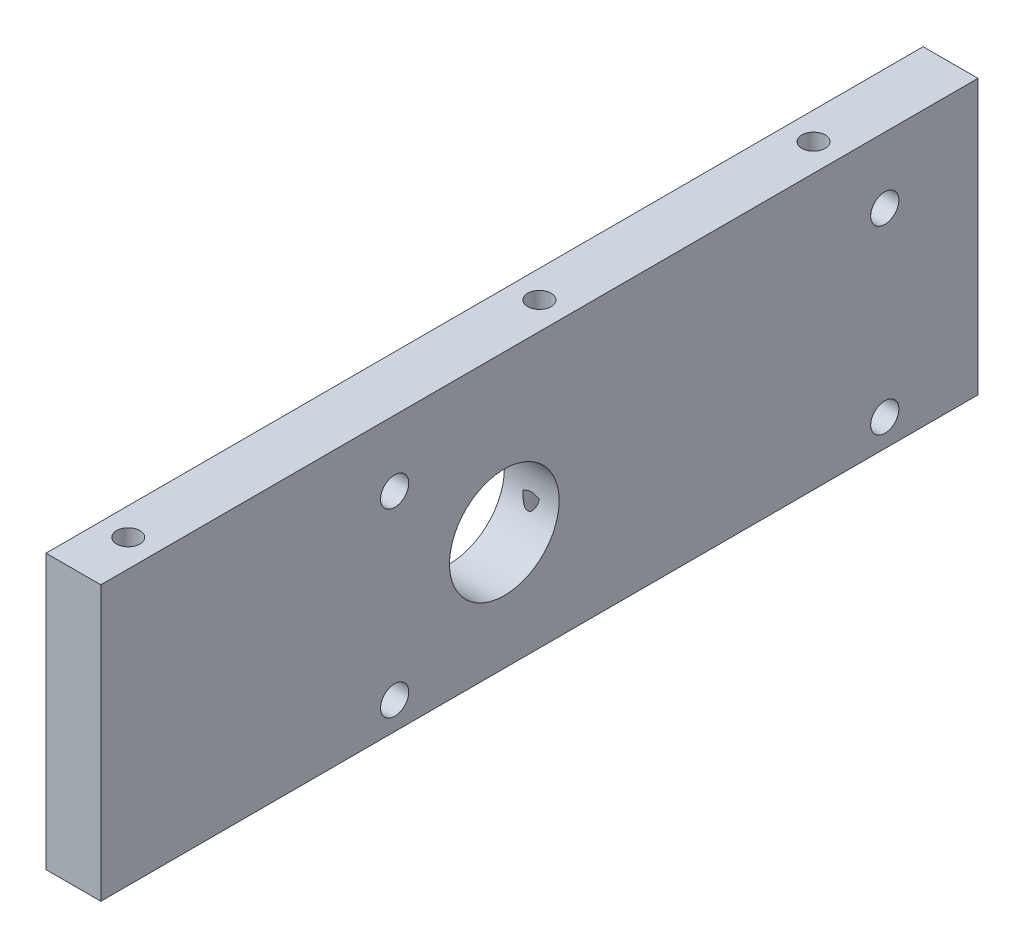
ISO-10303-21;
HEADER;
FILE_DESCRIPTION(('STEP AP214'),'2;1');
FILE_NAME('part.step','',(''),(''),'','','');
FILE_SCHEMA(('AUTOMOTIVE_DESIGN { 1 0 10303 214 1 1 1 1 }'));
ENDSEC;
DATA;
#1=APPLICATION_CONTEXT('core data for automotive mechanical design processes');
#2=APPLICATION_PROTOCOL_DEFINITION('international standard','automotive_design',2000,#1);
#3=PRODUCT_CONTEXT('',#1,'mechanical');
#4=PRODUCT('Part','Part','',(#3));
#5=PRODUCT_RELATED_PRODUCT_CATEGORY('part','',(#4));
#6=PRODUCT_DEFINITION_FORMATION('','',#4);
#7=PRODUCT_DEFINITION_CONTEXT('part definition',#1,'design');
#8=PRODUCT_DEFINITION('design','',#6,#7);
#9=PRODUCT_DEFINITION_SHAPE('','',#8);
#10=(LENGTH_UNIT() NAMED_UNIT(*) SI_UNIT(.MILLI.,.METRE.));
#11=(NAMED_UNIT(*) PLANE_ANGLE_UNIT() SI_UNIT($,.RADIAN.));
#12=(NAMED_UNIT(*) SI_UNIT($,.STERADIAN.) SOLID_ANGLE_UNIT());
#13=UNCERTAINTY_MEASURE_WITH_UNIT(LENGTH_MEASURE(1.E-05),#10,'distance_accuracy_value','');
#14=(GEOMETRIC_REPRESENTATION_CONTEXT(3) GLOBAL_UNCERTAINTY_ASSIGNED_CONTEXT((#13)) GLOBAL_UNIT_ASSIGNED_CONTEXT((#10,
#11,#12)) REPRESENTATION_CONTEXT('',''));
#15=CARTESIAN_POINT('',(0.,0.,0.));
#16=DIRECTION('',(0.,0.,1.));
#17=DIRECTION('',(1.,0.,0.));
#18=AXIS2_PLACEMENT_3D('',#15,#16,#17);
#19=CARTESIAN_POINT('',(3.175,-15.875,-50.8));
#20=DIRECTION('',(0.,0.,1.));
#21=DIRECTION('',(1.,0.,0.));
#22=AXIS2_PLACEMENT_3D('',#19,#20,#21);
#23=PLANE('',#22);
#24=DIRECTION('',(0.,1.,0.));
#25=VECTOR('',#24,1.);
#26=CARTESIAN_POINT('',(-3.175,-15.875,-50.8));
#27=LINE('',#26,#25);
#28=CARTESIAN_POINT('',(-3.175,-15.875,-50.8));
#29=VERTEX_POINT('',#28);
#30=CARTESIAN_POINT('',(-3.175,15.875,-50.8));
#31=VERTEX_POINT('',#30);
#32=EDGE_CURVE('E185',#29,#31,#27,.T.);
#33=ORIENTED_EDGE('',*,*,#32,.T.);
#34=DIRECTION('',(-1.,0.,0.));
#35=VECTOR('',#34,1.);
#36=CARTESIAN_POINT('',(3.175,15.875,-50.8));
#37=LINE('',#36,#35);
#38=CARTESIAN_POINT('',(3.175,15.875,-50.8));
#39=VERTEX_POINT('',#38);
#40=EDGE_CURVE('E208',#39,#31,#37,.T.);
#41=ORIENTED_EDGE('',*,*,#40,.F.);
#42=DIRECTION('',(0.,1.,0.));
#43=VECTOR('',#42,1.);
#44=CARTESIAN_POINT('',(3.175,-15.875,-50.8));
#45=LINE('',#44,#43);
#46=CARTESIAN_POINT('',(3.175,-15.875,-50.8));
#47=VERTEX_POINT('',#46);
#48=EDGE_CURVE('E188',#47,#39,#45,.T.);
#49=ORIENTED_EDGE('',*,*,#48,.F.);
#50=DIRECTION('',(-1.,0.,0.));
#51=VECTOR('',#50,1.);
#52=CARTESIAN_POINT('',(3.175,-15.875,-50.8));
#53=LINE('',#52,#51);
#54=EDGE_CURVE('E194',#47,#29,#53,.T.);
#55=ORIENTED_EDGE('',*,*,#54,.T.);
#56=EDGE_LOOP('',(#33,#41,#49,#55));
#57=FACE_BOUND('',#56,.T.);
#58=ADVANCED_FACE('F36',(#57),#23,.F.);
#59=CARTESIAN_POINT('',(3.175,15.875,50.8));
#60=DIRECTION('',(0.,-1.,0.));
#61=DIRECTION('',(0.,0.,-1.));
#62=AXIS2_PLACEMENT_3D('',#59,#60,#61);
#63=PLANE('',#62);
#64=CARTESIAN_POINT('',(0.,15.875,44.45));
#65=DIRECTION('',(0.,1.,0.));
#66=DIRECTION('',(0.,0.,1.));
#67=AXIS2_PLACEMENT_3D('',#64,#65,#66);
#68=CIRCLE('',#67,1.35254999999999);
#69=CARTESIAN_POINT('',(0.,15.875,45.80255));
#70=VERTEX_POINT('',#69);
#71=EDGE_CURVE('E139',#70,#70,#68,.T.);
#72=ORIENTED_EDGE('',*,*,#71,.F.);
#73=EDGE_LOOP('',(#72));
#74=FACE_BOUND('',#73,.T.);
#75=CARTESIAN_POINT('',(0.,15.875,-34.925));
#76=DIRECTION('',(0.,1.,0.));
#77=DIRECTION('',(0.,0.,1.));
#78=AXIS2_PLACEMENT_3D('',#75,#76,#77);
#79=CIRCLE('',#78,1.35254999999999);
#80=CARTESIAN_POINT('',(0.,15.875,-33.57245));
#81=VERTEX_POINT('',#80);
#82=EDGE_CURVE('E145',#81,#81,#79,.T.);
#83=ORIENTED_EDGE('',*,*,#82,.F.);
#84=EDGE_LOOP('',(#83));
#85=FACE_BOUND('',#84,.T.);
#86=CARTESIAN_POINT('',(0.,15.875,-3.175));
#87=DIRECTION('',(0.,1.,0.));
#88=DIRECTION('',(0.,0.,1.));
#89=AXIS2_PLACEMENT_3D('',#86,#87,#88);
#90=CIRCLE('',#89,1.35254999999999);
#91=CARTESIAN_POINT('',(0.,15.875,-1.82245000000002));
#92=VERTEX_POINT('',#91);
#93=EDGE_CURVE('E151',#92,#92,#90,.T.);
#94=ORIENTED_EDGE('',*,*,#93,.F.);
#95=EDGE_LOOP('',(#94));
#96=FACE_BOUND('',#95,.T.);
#97=DIRECTION('',(0.,0.,1.));
#98=VECTOR('',#97,1.);
#99=CARTESIAN_POINT('',(-3.175,15.875,50.8));
#100=LINE('',#99,#98);
#101=CARTESIAN_POINT('',(-3.175,15.875,50.8));
#102=VERTEX_POINT('',#101);
#103=EDGE_CURVE('E197',#31,#102,#100,.T.);
#104=ORIENTED_EDGE('',*,*,#103,.T.);
#105=DIRECTION('',(-1.,0.,0.));
#106=VECTOR('',#105,1.);
#107=CARTESIAN_POINT('',(3.175,15.875,50.8));
#108=LINE('',#107,#106);
#109=CARTESIAN_POINT('',(3.175,15.875,50.8));
#110=VERTEX_POINT('',#109);
#111=EDGE_CURVE('E205',#110,#102,#108,.T.);
#112=ORIENTED_EDGE('',*,*,#111,.F.);
#113=DIRECTION('',(0.,0.,1.));
#114=VECTOR('',#113,1.);
#115=CARTESIAN_POINT('',(3.175,15.875,50.8));
#116=LINE('',#115,#114);
#117=EDGE_CURVE('E93',#39,#110,#116,.T.);
#118=ORIENTED_EDGE('',*,*,#117,.F.);
#119=ORIENTED_EDGE('',*,*,#40,.T.);
#120=EDGE_LOOP('',(#104,#112,#118,#119));
#121=FACE_BOUND('',#120,.T.);
#122=ADVANCED_FACE('F270',(#74,#85,#96,#121),#63,.F.);
#123=CARTESIAN_POINT('',(3.175,-15.875,50.8));
#124=DIRECTION('',(0.,0.,-1.));
#125=DIRECTION('',(-1.,0.,0.));
#126=AXIS2_PLACEMENT_3D('',#123,#124,#125);
#127=PLANE('',#126);
#128=DIRECTION('',(0.,-1.,0.));
#129=VECTOR('',#128,1.);
#130=CARTESIAN_POINT('',(-3.175,-15.875,50.8));
#131=LINE('',#130,#129);
#132=CARTESIAN_POINT('',(-3.175,-15.875,50.8));
#133=VERTEX_POINT('',#132);
#134=EDGE_CURVE('E199',#102,#133,#131,.T.);
#135=ORIENTED_EDGE('',*,*,#134,.T.);
#136=DIRECTION('',(-1.,0.,0.));
#137=VECTOR('',#136,1.);
#138=CARTESIAN_POINT('',(3.175,-15.875,50.8));
#139=LINE('',#138,#137);
#140=CARTESIAN_POINT('',(3.175,-15.875,50.8));
#141=VERTEX_POINT('',#140);
#142=EDGE_CURVE('E203',#141,#133,#139,.T.);
#143=ORIENTED_EDGE('',*,*,#142,.F.);
#144=DIRECTION('',(0.,-1.,0.));
#145=VECTOR('',#144,1.);
#146=CARTESIAN_POINT('',(3.175,-15.875,50.8));
#147=LINE('',#146,#145);
#148=EDGE_CURVE('E191',#110,#141,#147,.T.);
#149=ORIENTED_EDGE('',*,*,#148,.F.);
#150=ORIENTED_EDGE('',*,*,#111,.T.);
#151=EDGE_LOOP('',(#135,#143,#149,#150));
#152=FACE_BOUND('',#151,.T.);
#153=ADVANCED_FACE('F275',(#152),#127,.F.);
#154=CARTESIAN_POINT('',(3.175,-15.875,50.8));
#155=DIRECTION('',(0.,1.,0.));
#156=DIRECTION('',(0.,0.,1.));
#157=AXIS2_PLACEMENT_3D('',#154,#155,#156);
#158=PLANE('',#157);
#159=CARTESIAN_POINT('',(0.,-15.875,44.45));
#160=DIRECTION('',(0.,-1.,0.));
#161=DIRECTION('',(0.,0.,-1.));
#162=AXIS2_PLACEMENT_3D('',#159,#160,#161);
#163=CIRCLE('',#162,1.35254999999999);
#164=CARTESIAN_POINT('',(0.,-15.875,43.09745));
#165=VERTEX_POINT('',#164);
#166=EDGE_CURVE('E125',#165,#165,#163,.T.);
#167=ORIENTED_EDGE('',*,*,#166,.F.);
#168=EDGE_LOOP('',(#167));
#169=FACE_BOUND('',#168,.T.);
#170=CARTESIAN_POINT('',(0.,-15.875,-34.925));
#171=DIRECTION('',(0.,-1.,0.));
#172=DIRECTION('',(0.,0.,-1.));
#173=AXIS2_PLACEMENT_3D('',#170,#171,#172);
#174=CIRCLE('',#173,1.35254999999999);
#175=CARTESIAN_POINT('',(0.,-15.875,-36.27755));
#176=VERTEX_POINT('',#175);
#177=EDGE_CURVE('E124',#176,#176,#174,.T.);
#178=ORIENTED_EDGE('',*,*,#177,.F.);
#179=EDGE_LOOP('',(#178));
#180=FACE_BOUND('',#179,.T.);
#181=CARTESIAN_POINT('',(0.,-15.875,-3.175));
#182=DIRECTION('',(0.,-1.,0.));
#183=DIRECTION('',(0.,0.,-1.));
#184=AXIS2_PLACEMENT_3D('',#181,#182,#183);
#185=CIRCLE('',#184,1.35254999999999);
#186=CARTESIAN_POINT('',(0.,-15.875,-4.52754999999999));
#187=VERTEX_POINT('',#186);
#188=EDGE_CURVE('E135',#187,#187,#185,.T.);
#189=ORIENTED_EDGE('',*,*,#188,.F.);
#190=EDGE_LOOP('',(#189));
#191=FACE_BOUND('',#190,.T.);
#192=DIRECTION('',(0.,0.,-1.));
#193=VECTOR('',#192,1.);
#194=CARTESIAN_POINT('',(-3.175,-15.875,50.8));
#195=LINE('',#194,#193);
#196=EDGE_CURVE('E85',#133,#29,#195,.T.);
#197=ORIENTED_EDGE('',*,*,#196,.T.);
#198=ORIENTED_EDGE('',*,*,#54,.F.);
#199=DIRECTION('',(0.,0.,-1.));
#200=VECTOR('',#199,1.);
#201=CARTESIAN_POINT('',(3.175,-15.875,50.8));
#202=LINE('',#201,#200);
#203=EDGE_CURVE('E64',#141,#47,#202,.T.);
#204=ORIENTED_EDGE('',*,*,#203,.F.);
#205=ORIENTED_EDGE('',*,*,#142,.T.);
#206=EDGE_LOOP('',(#197,#198,#204,#205));
#207=FACE_BOUND('',#206,.T.);
#208=ADVANCED_FACE('F288',(#169,#180,#191,#207),#158,.F.);
#209=CARTESIAN_POINT('',(3.175,0.,0.));
#210=DIRECTION('',(-1.,0.,0.));
#211=DIRECTION('',(0.,0.,1.));
#212=AXIS2_PLACEMENT_3D('',#209,#210,#211);
#213=PLANE('',#212);
#214=CARTESIAN_POINT('',(3.175,-2.2225,4.06399999999999));
#215=DIRECTION('',(1.,0.,0.));
#216=DIRECTION('',(0.,0.,-1.));
#217=AXIS2_PLACEMENT_3D('',#214,#215,#216);
#218=CIRCLE('',#217,6.35);
#219=CARTESIAN_POINT('',(3.175,-2.2225,-2.28600000000001));
#220=VERTEX_POINT('',#219);
#221=EDGE_CURVE('E177',#220,#220,#218,.T.);
#222=ORIENTED_EDGE('',*,*,#221,.F.);
#223=EDGE_LOOP('',(#222));
#224=FACE_BOUND('',#223,.T.);
#225=CARTESIAN_POINT('',(3.175,8.255,16.764));
#226=DIRECTION('',(1.,0.,0.));
#227=DIRECTION('',(0.,0.,-1.));
#228=AXIS2_PLACEMENT_3D('',#225,#226,#227);
#229=CIRCLE('',#228,1.63195);
#230=CARTESIAN_POINT('',(3.175,8.255,15.13205));
#231=VERTEX_POINT('',#230);
#232=EDGE_CURVE('E171',#231,#231,#229,.T.);
#233=ORIENTED_EDGE('',*,*,#232,.F.);
#234=EDGE_LOOP('',(#233));
#235=FACE_BOUND('',#234,.T.);
#236=CARTESIAN_POINT('',(3.175,8.255,-40.005));
#237=DIRECTION('',(1.,0.,0.));
#238=DIRECTION('',(0.,0.,-1.));
#239=AXIS2_PLACEMENT_3D('',#236,#237,#238);
#240=CIRCLE('',#239,1.63195);
#241=CARTESIAN_POINT('',(3.175,8.255,-41.63695));
#242=VERTEX_POINT('',#241);
#243=EDGE_CURVE('E165',#242,#242,#240,.T.);
#244=ORIENTED_EDGE('',*,*,#243,.F.);
#245=EDGE_LOOP('',(#244));
#246=FACE_BOUND('',#245,.T.);
#247=CARTESIAN_POINT('',(3.175,-12.7,-40.005));
#248=DIRECTION('',(1.,0.,0.));
#249=DIRECTION('',(0.,0.,-1.));
#250=AXIS2_PLACEMENT_3D('',#247,#248,#249);
#251=CIRCLE('',#250,1.63195);
#252=CARTESIAN_POINT('',(3.175,-12.7,-41.63695));
#253=VERTEX_POINT('',#252);
#254=EDGE_CURVE('E158',#253,#253,#251,.T.);
#255=ORIENTED_EDGE('',*,*,#254,.F.);
#256=EDGE_LOOP('',(#255));
#257=FACE_BOUND('',#256,.T.);
#258=CARTESIAN_POINT('',(3.175,-12.7,16.764));
#259=DIRECTION('',(1.,0.,0.));
#260=DIRECTION('',(0.,0.,-1.));
#261=AXIS2_PLACEMENT_3D('',#258,#259,#260);
#262=CIRCLE('',#261,1.63195);
#263=CARTESIAN_POINT('',(3.175,-12.7,15.13205));
#264=VERTEX_POINT('',#263);
#265=EDGE_CURVE('E182',#264,#264,#262,.T.);
#266=ORIENTED_EDGE('',*,*,#265,.F.);
#267=EDGE_LOOP('',(#266));
#268=FACE_BOUND('',#267,.T.);
#269=ORIENTED_EDGE('',*,*,#48,.T.);
#270=ORIENTED_EDGE('',*,*,#117,.T.);
#271=ORIENTED_EDGE('',*,*,#148,.T.);
#272=ORIENTED_EDGE('',*,*,#203,.T.);
#273=EDGE_LOOP('',(#269,#270,#271,#272));
#274=FACE_BOUND('',#273,.T.);
#275=ADVANCED_FACE('F286',(#224,#235,#246,#257,#268,#274),#213,.F.);
#276=CARTESIAN_POINT('',(-3.175,0.,0.));
#277=DIRECTION('',(-1.,0.,0.));
#278=DIRECTION('',(0.,0.,1.));
#279=AXIS2_PLACEMENT_3D('',#276,#277,#278);
#280=PLANE('',#279);
#281=CARTESIAN_POINT('',(-3.175,-2.2225,4.06399999999999));
#282=DIRECTION('',(-1.,0.,0.));
#283=DIRECTION('',(0.,0.,1.));
#284=AXIS2_PLACEMENT_3D('',#281,#282,#283);
#285=CIRCLE('',#284,6.35);
#286=CARTESIAN_POINT('',(-3.175,-2.2225,10.414));
#287=VERTEX_POINT('',#286);
#288=EDGE_CURVE('E157',#287,#287,#285,.F.);
#289=ORIENTED_EDGE('',*,*,#288,.T.);
#290=EDGE_LOOP('',(#289));
#291=FACE_BOUND('',#290,.T.);
#292=CARTESIAN_POINT('',(-3.175,8.255,16.764));
#293=DIRECTION('',(-1.,0.,0.));
#294=DIRECTION('',(0.,0.,1.));
#295=AXIS2_PLACEMENT_3D('',#292,#293,#294);
#296=CIRCLE('',#295,1.63195);
#297=CARTESIAN_POINT('',(-3.175,8.255,18.39595));
#298=VERTEX_POINT('',#297);
#299=EDGE_CURVE('E174',#298,#298,#296,.F.);
#300=ORIENTED_EDGE('',*,*,#299,.T.);
#301=EDGE_LOOP('',(#300));
#302=FACE_BOUND('',#301,.T.);
#303=CARTESIAN_POINT('',(-3.175,8.255,-40.005));
#304=DIRECTION('',(-1.,0.,0.));
#305=DIRECTION('',(0.,0.,1.));
#306=AXIS2_PLACEMENT_3D('',#303,#304,#305);
#307=CIRCLE('',#306,1.63195);
#308=CARTESIAN_POINT('',(-3.175,8.255,-38.37305));
#309=VERTEX_POINT('',#308);
#310=EDGE_CURVE('E168',#309,#309,#307,.F.);
#311=ORIENTED_EDGE('',*,*,#310,.T.);
#312=EDGE_LOOP('',(#311));
#313=FACE_BOUND('',#312,.T.);
#314=CARTESIAN_POINT('',(-3.175,-12.7,-40.005));
#315=DIRECTION('',(-1.,0.,0.));
#316=DIRECTION('',(0.,0.,1.));
#317=AXIS2_PLACEMENT_3D('',#314,#315,#316);
#318=CIRCLE('',#317,1.63195);
#319=CARTESIAN_POINT('',(-3.175,-12.7,-38.37305));
#320=VERTEX_POINT('',#319);
#321=EDGE_CURVE('E162',#320,#320,#318,.F.);
#322=ORIENTED_EDGE('',*,*,#321,.T.);
#323=EDGE_LOOP('',(#322));
#324=FACE_BOUND('',#323,.T.);
#325=CARTESIAN_POINT('',(-3.175,-12.7,16.764));
#326=DIRECTION('',(-1.,0.,0.));
#327=DIRECTION('',(0.,0.,1.));
#328=AXIS2_PLACEMENT_3D('',#325,#326,#327);
#329=CIRCLE('',#328,1.63195);
#330=CARTESIAN_POINT('',(-3.175,-12.7,18.39595));
#331=VERTEX_POINT('',#330);
#332=EDGE_CURVE('E161',#331,#331,#329,.F.);
#333=ORIENTED_EDGE('',*,*,#332,.T.);
#334=EDGE_LOOP('',(#333));
#335=FACE_BOUND('',#334,.T.);
#336=ORIENTED_EDGE('',*,*,#32,.F.);
#337=ORIENTED_EDGE('',*,*,#196,.F.);
#338=ORIENTED_EDGE('',*,*,#134,.F.);
#339=ORIENTED_EDGE('',*,*,#103,.F.);
#340=EDGE_LOOP('',(#336,#337,#338,#339));
#341=FACE_BOUND('',#340,.T.);
#342=ADVANCED_FACE('F281',(#291,#302,#313,#324,#335,#341),#280,.T.);
#343=CARTESIAN_POINT('',(-3.176,-12.7,16.764));
#344=DIRECTION('',(1.,0.,0.));
#345=DIRECTION('',(0.,0.,-1.));
#346=AXIS2_PLACEMENT_3D('',#343,#344,#345);
#347=CYLINDRICAL_SURFACE('',#346,1.63195);
#348=ORIENTED_EDGE('',*,*,#332,.F.);
#349=EDGE_LOOP('',(#348));
#350=FACE_BOUND('',#349,.T.);
#351=ORIENTED_EDGE('',*,*,#265,.T.);
#352=EDGE_LOOP('',(#351));
#353=FACE_BOUND('',#352,.T.);
#354=ADVANCED_FACE('F256',(#350,#353),#347,.F.);
#355=CARTESIAN_POINT('',(-3.176,-12.7,-40.005));
#356=DIRECTION('',(1.,0.,0.));
#357=DIRECTION('',(0.,0.,-1.));
#358=AXIS2_PLACEMENT_3D('',#355,#356,#357);
#359=CYLINDRICAL_SURFACE('',#358,1.63195);
#360=ORIENTED_EDGE('',*,*,#321,.F.);
#361=EDGE_LOOP('',(#360));
#362=FACE_BOUND('',#361,.T.);
#363=ORIENTED_EDGE('',*,*,#254,.T.);
#364=EDGE_LOOP('',(#363));
#365=FACE_BOUND('',#364,.T.);
#366=ADVANCED_FACE('F252',(#362,#365),#359,.F.);
#367=CARTESIAN_POINT('',(-3.176,8.255,-40.005));
#368=DIRECTION('',(1.,0.,0.));
#369=DIRECTION('',(0.,0.,-1.));
#370=AXIS2_PLACEMENT_3D('',#367,#368,#369);
#371=CYLINDRICAL_SURFACE('',#370,1.63195);
#372=ORIENTED_EDGE('',*,*,#310,.F.);
#373=EDGE_LOOP('',(#372));
#374=FACE_BOUND('',#373,.T.);
#375=ORIENTED_EDGE('',*,*,#243,.T.);
#376=EDGE_LOOP('',(#375));
#377=FACE_BOUND('',#376,.T.);
#378=ADVANCED_FACE('F255',(#374,#377),#371,.F.);
#379=CARTESIAN_POINT('',(-3.176,8.255,16.764));
#380=DIRECTION('',(1.,0.,0.));
#381=DIRECTION('',(0.,0.,-1.));
#382=AXIS2_PLACEMENT_3D('',#379,#380,#381);
#383=CYLINDRICAL_SURFACE('',#382,1.63195);
#384=ORIENTED_EDGE('',*,*,#299,.F.);
#385=EDGE_LOOP('',(#384));
#386=FACE_BOUND('',#385,.T.);
#387=ORIENTED_EDGE('',*,*,#232,.T.);
#388=EDGE_LOOP('',(#387));
#389=FACE_BOUND('',#388,.T.);
#390=ADVANCED_FACE('F259',(#386,#389),#383,.F.);
#391=CARTESIAN_POINT('',(-3.176,-2.2225,4.06399999999999));
#392=DIRECTION('',(1.,0.,0.));
#393=DIRECTION('',(0.,0.,-1.));
#394=AXIS2_PLACEMENT_3D('',#391,#392,#393);
#395=CYLINDRICAL_SURFACE('',#394,6.35);
#396=CARTESIAN_POINT('',(-2.71412164853598,-4.14203364912908,-1.98892413382667));
#397=CARTESIAN_POINT('',(-2.65078701661804,-4.10428461211131,-2.00089565017358));
#398=CARTESIAN_POINT('',(-2.58732233711637,-4.06662240990186,-2.01245023286295));
#399=CARTESIAN_POINT('',(-2.46011371861487,-3.9915239214137,-2.03473656616217));
#400=CARTESIAN_POINT('',(-2.39636977405843,-3.95408763966574,-2.04546830032024));
#401=CARTESIAN_POINT('',(-2.20455727308252,-3.84211843580124,-2.07646720366916));
#402=CARTESIAN_POINT('',(-2.07604360864824,-3.76800622556294,-2.09551248010652));
#403=CARTESIAN_POINT('',(-1.8120184004149,-3.61846330879807,-2.13115326327357));
#404=CARTESIAN_POINT('',(-1.6764426340886,-3.54311176933802,-2.14760916434109));
#405=CARTESIAN_POINT('',(-1.47134192103341,-3.43287305937288,-2.16969140439581));
#406=CARTESIAN_POINT('',(-1.40270179466372,-3.39659976315947,-2.17661723069485));
#407=CARTESIAN_POINT('',(-1.26465524596658,-3.32538410128019,-2.18959520904327));
#408=CARTESIAN_POINT('',(-1.19524888943105,-3.29044162247342,-2.19564743548532));
#409=CARTESIAN_POINT('',(-1.06193489059193,-3.22566476535457,-2.2063377439253));
#410=CARTESIAN_POINT('',(-0.998117948685459,-3.19565788759525,-2.21105506462585));
#411=CARTESIAN_POINT('',(-0.869347930049044,-3.13796062414747,-2.21973150577253));
#412=CARTESIAN_POINT('',(-0.804394384896689,-3.11027122209441,-2.22369030517985));
#413=CARTESIAN_POINT('',(-0.673685624650855,-3.05863454820569,-2.23076370772394));
#414=CARTESIAN_POINT('',(-0.607944474828469,-3.03465330788842,-2.23388619297426));
#415=CARTESIAN_POINT('',(-0.474748884830303,-2.99187578514016,-2.23925525236969));
#416=CARTESIAN_POINT('',(-0.407295936731462,-2.97307514585862,-2.24150256319205));
#417=CARTESIAN_POINT('',(-0.293027913702846,-2.9479513180044,-2.24443292032662));
#418=CARTESIAN_POINT('',(-0.246682322689638,-2.93955829586156,-2.24538720001254));
#419=CARTESIAN_POINT('',(-0.153420909482538,-2.92692819178857,-2.24680995300578));
#420=CARTESIAN_POINT('',(-0.106505329515876,-2.92268940295649,-2.247278625845));
#421=CARTESIAN_POINT('',(-0.0125799432134543,-2.91882226012608,-2.24770656672275));
#422=CARTESIAN_POINT('',(0.0344294216300791,-2.91918367530462,-2.24766696515852));
#423=CARTESIAN_POINT('',(0.128189719303331,-2.92444888361814,-2.2470834088847));
#424=CARTESIAN_POINT('',(0.174940588823315,-2.92935374390246,-2.24653933568645));
#425=CARTESIAN_POINT('',(0.286896534588386,-2.94604766070884,-2.2446508016781));
#426=CARTESIAN_POINT('',(0.351794899900335,-2.95983675680586,-2.24306938985169));
#427=CARTESIAN_POINT('',(0.480010850587626,-2.99336181770236,-2.23905896217487));
#428=CARTESIAN_POINT('',(0.543326472575473,-3.01310480687555,-2.23662894460559));
#429=CARTESIAN_POINT('',(0.668880797449011,-3.05678959782941,-2.23099403342221));
#430=CARTESIAN_POINT('',(0.731109962033753,-3.080757573219,-2.22778425942327));
#431=CARTESIAN_POINT('',(0.854335055514038,-3.13146099199577,-2.22065953693018));
#432=CARTESIAN_POINT('',(0.915331584069898,-3.1581950489946,-2.21674494097872));
#433=CARTESIAN_POINT('',(1.00094843605602,-3.19736029899882,-2.21073371880028));
#434=CARTESIAN_POINT('',(1.02595571784857,-3.20900058886667,-2.20891471971231));
#435=CARTESIAN_POINT('',(1.07577388140507,-3.23254332529303,-2.20516694163697));
#436=CARTESIAN_POINT('',(1.1005850658282,-3.24444516827959,-2.20323840185432));
#437=CARTESIAN_POINT('',(1.18533950400192,-3.28562570557295,-2.19644212028521));
#438=CARTESIAN_POINT('',(1.24497104316002,-3.3155016263963,-2.19130163223612));
#439=CARTESIAN_POINT('',(1.36364604044549,-3.37628828286397,-2.18037576784565));
#440=CARTESIAN_POINT('',(1.42268945493575,-3.40719909456292,-2.17459034403453));
#441=CARTESIAN_POINT('',(1.59914576748774,-3.50107390631167,-2.15627367299971));
#442=CARTESIAN_POINT('',(1.71585887532386,-3.56516739215843,-2.14278411573725));
#443=CARTESIAN_POINT('',(1.94814564277452,-3.69516839381789,-2.11323318299526));
#444=CARTESIAN_POINT('',(2.06371749354469,-3.76107830674959,-2.09716825959999));
#445=CARTESIAN_POINT('',(2.2938235710844,-3.89398108274709,-2.06244821867335));
#446=CARTESIAN_POINT('',(2.40835794771624,-3.96097378538281,-2.0437934818055));
#447=CARTESIAN_POINT('',(2.5642050302358,-4.05297344472648,-2.01650401406764));
#448=CARTESIAN_POINT('',(2.60590361202823,-4.07767191172057,-2.00901477139641));
#449=CARTESIAN_POINT('',(2.68915434904908,-4.12713500394011,-1.99368397013546));
#450=CARTESIAN_POINT('',(2.73070658906669,-4.15189956756595,-1.98584267323291));
#451=CARTESIAN_POINT('',(2.77220263063722,-4.17670061460827,-1.97782091408418));
#452=B_SPLINE_CURVE_WITH_KNOTS('',3,(#396,#397,#398,#399,#400,#401,#402,#403,#404,#405,#406,
#407,#408,#409,#410,#411,#412,#413,#414,#415,#416,#417,#418,#419,#420,#421,#422,#423,#424,#425,
#426,#427,#428,#429,#430,#431,#432,#433,#434,#435,#436,#437,#438,#439,#440,#441,#442,#443,#444,
#445,#446,#447,#448,#449,#450,#451),.UNSPECIFIED.,.F.,.F.,(4,2,2,2,2,2,2,2,2,2,2,2,2,2,2,2,2,2,
2,2,2,2,2,2,2,2,2,4),(0.,0.224087556553959,0.448179592279077,0.89684356672341,1.36469579978843,
1.59851235610162,1.83230898966681,2.04430634230309,2.25639322408769,2.46640464399763,
2.67623890290329,2.81740919522738,2.95852145879422,3.09931994456315,3.24015150900124,
3.43882382938796,3.63773146552868,3.83791764998801,4.03800398071338,4.12093363116432,
4.2036886737386,4.40435267517505,4.60503145601729,5.00647588014063,5.40847817762378,
5.8104214492699,5.95753891933147,6.10454878889912),.UNSPECIFIED.);
#453=CARTESIAN_POINT('',(-0.95192986171653,-3.175,-2.21415607881806));
#454=VERTEX_POINT('',#453);
#455=CARTESIAN_POINT('',(0.951929861716567,-3.175,-2.21415607881806));
#456=VERTEX_POINT('',#455);
#457=EDGE_CURVE('E49',#454,#456,#452,.T.);
#458=ORIENTED_EDGE('',*,*,#457,.T.);
#459=CARTESIAN_POINT('',(0.951929861716562,-3.175,-2.21415607881806));
#460=CARTESIAN_POINT('',(0.940931554686237,-3.24655694230946,-2.20330929534767));
#461=CARTESIAN_POINT('',(0.928428219908752,-3.3177404481302,-2.1912487518486));
#462=CARTESIAN_POINT('',(0.899634061233396,-3.45920756722001,-2.1648218295511));
#463=CARTESIAN_POINT('',(0.883328076078736,-3.52948635751338,-2.15044629376217));
#464=CARTESIAN_POINT('',(0.846049398463792,-3.6690744377835,-2.11945286456216));
#465=CARTESIAN_POINT('',(0.825033129901408,-3.7383677950198,-2.10281464362242));
#466=CARTESIAN_POINT('',(0.777369003967077,-3.87442962556537,-2.06776493168448));
#467=CARTESIAN_POINT('',(0.750731840044605,-3.94120261334585,-2.0493568434578));
#468=CARTESIAN_POINT('',(0.699052596086801,-4.05234276926253,-2.0168303946381));
#469=CARTESIAN_POINT('',(0.675772201577615,-4.09761073248459,-2.00300879960795));
#470=CARTESIAN_POINT('',(0.62490055029874,-4.1856007074556,-1.97511084897281));
#471=CARTESIAN_POINT('',(0.597310626691418,-4.22832350093109,-1.96103457334054));
#472=CARTESIAN_POINT('',(0.536694760476799,-4.31055747502401,-1.93303424648602));
#473=CARTESIAN_POINT('',(0.503617169267133,-4.3500322277633,-1.91911312934683));
#474=CARTESIAN_POINT('',(0.431341478545563,-4.42344181923237,-1.89249793947678));
#475=CARTESIAN_POINT('',(0.392159280338654,-4.45739059504043,-1.87980081380091));
#476=CARTESIAN_POINT('',(0.32287414718986,-4.50596171461605,-1.86126072940165));
#477=CARTESIAN_POINT('',(0.294755392811472,-4.52309320267676,-1.85461735287059));
#478=CARTESIAN_POINT('',(0.236010018525784,-4.55310382957271,-1.84286420398063));
#479=CARTESIAN_POINT('',(0.205385116950853,-4.56598585205343,-1.83775339185374));
#480=CARTESIAN_POINT('',(0.141806885640943,-4.58661791516725,-1.8295196802759));
#481=CARTESIAN_POINT('',(0.108833087622906,-4.59431457130354,-1.82641747215754));
#482=CARTESIAN_POINT('',(0.0419015302692665,-4.60356319399702,-1.82268543742933));
#483=CARTESIAN_POINT('',(0.0079448021227334,-4.60512138072387,-1.82205310807328));
#484=CARTESIAN_POINT('',(-0.0552893180907944,-4.60214137659927,-1.82325799009609));
#485=CARTESIAN_POINT('',(-0.0846115368793932,-4.59835482778969,-1.82479074225533));
#486=CARTESIAN_POINT('',(-0.142168683276292,-4.58631966373976,-1.82963200172385));
#487=CARTESIAN_POINT('',(-0.170403012197016,-4.57806862813653,-1.83294147225006));
#488=CARTESIAN_POINT('',(-0.232658459274872,-4.55491246820878,-1.84214460927145));
#489=CARTESIAN_POINT('',(-0.266162231065619,-4.53880731983342,-1.84849653062812));
#490=CARTESIAN_POINT('',(-0.32992601835172,-4.50170833098828,-1.86289686211806));
#491=CARTESIAN_POINT('',(-0.360180083082706,-4.48070573809864,-1.87094830706751));
#492=CARTESIAN_POINT('',(-0.432236990659686,-4.42320984828961,-1.89257059115436));
#493=CARTESIAN_POINT('',(-0.471906075766766,-4.3843272753699,-1.90684034667392));
#494=CARTESIAN_POINT('',(-0.544600917906411,-4.3011308171154,-1.93631311626697));
#495=CARTESIAN_POINT('',(-0.577610313350425,-4.25680397551376,-1.95151831188267));
#496=CARTESIAN_POINT('',(-0.635313012130599,-4.16874489068028,-1.98055006243942));
#497=CARTESIAN_POINT('',(-0.660488876667463,-4.12532287058415,-1.99437666750967));
#498=CARTESIAN_POINT('',(-0.706985379003925,-4.03631402038762,-2.02161815407288));
#499=CARTESIAN_POINT('',(-0.728302629647674,-3.99072533223925,-2.03503266533016));
#500=CARTESIAN_POINT('',(-0.767722356499518,-3.89784540818819,-2.06119821353725));
#501=CARTESIAN_POINT('',(-0.78581545233132,-3.85054967081762,-2.07394724061742));
#502=CARTESIAN_POINT('',(-0.819206334381737,-3.75475111323654,-2.09856083656431));
#503=CARTESIAN_POINT('',(-0.834503171534272,-3.70624788952102,-2.11042510433279));
#504=CARTESIAN_POINT('',(-0.871322044843615,-3.57836500554451,-2.14008595105832));
#505=CARTESIAN_POINT('',(-0.890930584164138,-3.4982418372626,-2.15707355115338));
#506=CARTESIAN_POINT('',(-0.916507424916916,-3.37729135030992,-2.18024740510741));
#507=CARTESIAN_POINT('',(-0.924363378452725,-3.33705304053368,-2.18755607580254));
#508=CARTESIAN_POINT('',(-0.93895711945341,-3.25625622444241,-2.20142308463825));
#509=CARTESIAN_POINT('',(-0.945695194546841,-3.21569780331387,-2.20798161565339));
#510=CARTESIAN_POINT('',(-0.951929861716527,-3.175,-2.21415607881806));
#511=B_SPLINE_CURVE_WITH_KNOTS('',3,(#459,#460,#461,#462,#463,#464,#465,#466,#467,#468,#469,
#470,#471,#472,#473,#474,#475,#476,#477,#478,#479,#480,#481,#482,#483,#484,#485,#486,#487,#488,
#489,#490,#491,#492,#493,#494,#495,#496,#497,#498,#499,#500,#501,#502,#503,#504,#505,#506,#507,
#508,#509,#510),.UNSPECIFIED.,.F.,.F.,(4,2,2,2,2,2,2,2,2,2,2,2,2,2,2,2,2,2,2,2,2,2,2,2,2,4),(0.,
0.219651805883362,0.440194811183506,0.66286913931641,0.885123600435528,1.04318031515208,
1.20118823115876,1.36077775998537,1.51995833299297,1.62040655959608,1.72078648212712,
1.82218466051592,1.92348006469343,2.01186591828862,2.10029973719448,2.21281030449746,
2.3255235062219,2.49661151464338,2.6681148679722,2.82407441340336,2.98017020573862,
3.13671298193417,3.2933087913853,3.54566576453082,3.67058245437386,3.79546695331286),.UNSPECIFIED.);
#512=EDGE_CURVE('E11',#456,#454,#511,.T.);
#513=ORIENTED_EDGE('',*,*,#512,.T.);
#514=EDGE_LOOP('',(#458,#513));
#515=FACE_BOUND('',#514,.T.);
#516=ORIENTED_EDGE('',*,*,#288,.F.);
#517=EDGE_LOOP('',(#516));
#518=FACE_BOUND('',#517,.T.);
#519=ORIENTED_EDGE('',*,*,#221,.T.);
#520=EDGE_LOOP('',(#519));
#521=FACE_BOUND('',#520,.T.);
#522=ADVANCED_FACE('F215',(#515,#518,#521),#395,.F.);
#523=CARTESIAN_POINT('',(0.,3.175,-3.175));
#524=DIRECTION('',(0.,1.,0.));
#525=DIRECTION('',(0.,0.,1.));
#526=AXIS2_PLACEMENT_3D('',#523,#524,#525);
#527=CONICAL_SURFACE('',#526,1.35255,1.02974425867665);
#528=CARTESIAN_POINT('',(0.,2.36230596973427,-3.175));
#529=VERTEX_POINT('',#528);
#530=VERTEX_LOOP('',#529);
#531=FACE_BOUND('',#530,.T.);
#532=CARTESIAN_POINT('',(0.,3.175,-3.175));
#533=DIRECTION('',(0.,1.,0.));
#534=DIRECTION('',(0.,0.,1.));
#535=AXIS2_PLACEMENT_3D('',#532,#533,#534);
#536=CIRCLE('',#535,1.35255);
#537=CARTESIAN_POINT('',(0.,3.175,-1.82245000000001));
#538=VERTEX_POINT('',#537);
#539=EDGE_CURVE('E154',#538,#538,#536,.T.);
#540=ORIENTED_EDGE('',*,*,#539,.T.);
#541=EDGE_LOOP('',(#540));
#542=FACE_BOUND('',#541,.T.);
#543=ADVANCED_FACE('F247',(#531,#542),#527,.F.);
#544=CARTESIAN_POINT('',(0.,15.875,-3.175));
#545=DIRECTION('',(0.,1.,0.));
#546=DIRECTION('',(0.,0.,1.));
#547=AXIS2_PLACEMENT_3D('',#544,#545,#546);
#548=CYLINDRICAL_SURFACE('',#547,1.35254999999999);
#549=ORIENTED_EDGE('',*,*,#539,.F.);
#550=EDGE_LOOP('',(#549));
#551=FACE_BOUND('',#550,.T.);
#552=ORIENTED_EDGE('',*,*,#93,.T.);
#553=EDGE_LOOP('',(#552));
#554=FACE_BOUND('',#553,.T.);
#555=ADVANCED_FACE('F243',(#551,#554),#548,.F.);
#556=CARTESIAN_POINT('',(0.,3.175,-34.925));
#557=DIRECTION('',(0.,1.,0.));
#558=DIRECTION('',(0.,0.,1.));
#559=AXIS2_PLACEMENT_3D('',#556,#557,#558);
#560=CONICAL_SURFACE('',#559,1.35255,1.02974425867665);
#561=CARTESIAN_POINT('',(0.,2.36230596973427,-34.925));
#562=VERTEX_POINT('',#561);
#563=VERTEX_LOOP('',#562);
#564=FACE_BOUND('',#563,.T.);
#565=CARTESIAN_POINT('',(0.,3.175,-34.925));
#566=DIRECTION('',(0.,1.,0.));
#567=DIRECTION('',(0.,0.,1.));
#568=AXIS2_PLACEMENT_3D('',#565,#566,#567);
#569=CIRCLE('',#568,1.35255);
#570=CARTESIAN_POINT('',(0.,3.175,-33.57245));
#571=VERTEX_POINT('',#570);
#572=EDGE_CURVE('E148',#571,#571,#569,.T.);
#573=ORIENTED_EDGE('',*,*,#572,.T.);
#574=EDGE_LOOP('',(#573));
#575=FACE_BOUND('',#574,.T.);
#576=ADVANCED_FACE('F239',(#564,#575),#560,.F.);
#577=CARTESIAN_POINT('',(0.,15.875,-34.925));
#578=DIRECTION('',(0.,1.,0.));
#579=DIRECTION('',(0.,0.,1.));
#580=AXIS2_PLACEMENT_3D('',#577,#578,#579);
#581=CYLINDRICAL_SURFACE('',#580,1.35254999999999);
#582=ORIENTED_EDGE('',*,*,#572,.F.);
#583=EDGE_LOOP('',(#582));
#584=FACE_BOUND('',#583,.T.);
#585=ORIENTED_EDGE('',*,*,#82,.T.);
#586=EDGE_LOOP('',(#585));
#587=FACE_BOUND('',#586,.T.);
#588=ADVANCED_FACE('F235',(#584,#587),#581,.F.);
#589=CARTESIAN_POINT('',(0.,3.175,44.45));
#590=DIRECTION('',(0.,1.,0.));
#591=DIRECTION('',(0.,0.,1.));
#592=AXIS2_PLACEMENT_3D('',#589,#590,#591);
#593=CONICAL_SURFACE('',#592,1.35255,1.02974425867665);
#594=CARTESIAN_POINT('',(0.,2.36230596973427,44.45));
#595=VERTEX_POINT('',#594);
#596=VERTEX_LOOP('',#595);
#597=FACE_BOUND('',#596,.T.);
#598=CARTESIAN_POINT('',(0.,3.175,44.45));
#599=DIRECTION('',(0.,1.,0.));
#600=DIRECTION('',(0.,0.,1.));
#601=AXIS2_PLACEMENT_3D('',#598,#599,#600);
#602=CIRCLE('',#601,1.35255);
#603=CARTESIAN_POINT('',(0.,3.175,45.80255));
#604=VERTEX_POINT('',#603);
#605=EDGE_CURVE('E142',#604,#604,#602,.T.);
#606=ORIENTED_EDGE('',*,*,#605,.T.);
#607=EDGE_LOOP('',(#606));
#608=FACE_BOUND('',#607,.T.);
#609=ADVANCED_FACE('F231',(#597,#608),#593,.F.);
#610=CARTESIAN_POINT('',(0.,15.875,44.45));
#611=DIRECTION('',(0.,1.,0.));
#612=DIRECTION('',(0.,0.,1.));
#613=AXIS2_PLACEMENT_3D('',#610,#611,#612);
#614=CYLINDRICAL_SURFACE('',#613,1.35254999999999);
#615=ORIENTED_EDGE('',*,*,#605,.F.);
#616=EDGE_LOOP('',(#615));
#617=FACE_BOUND('',#616,.T.);
#618=ORIENTED_EDGE('',*,*,#71,.T.);
#619=EDGE_LOOP('',(#618));
#620=FACE_BOUND('',#619,.T.);
#621=ADVANCED_FACE('F228',(#617,#620),#614,.F.);
#622=CARTESIAN_POINT('',(0.,-15.875,-3.175));
#623=DIRECTION('',(0.,-1.,0.));
#624=DIRECTION('',(0.,0.,-1.));
#625=AXIS2_PLACEMENT_3D('',#622,#623,#624);
#626=CYLINDRICAL_SURFACE('',#625,1.35254999999999);
#627=ORIENTED_EDGE('',*,*,#188,.T.);
#628=EDGE_LOOP('',(#627));
#629=FACE_BOUND('',#628,.T.);
#630=CARTESIAN_POINT('',(0.,-3.175,-3.175));
#631=DIRECTION('',(0.,-1.,0.));
#632=DIRECTION('',(0.,0.,-1.));
#633=AXIS2_PLACEMENT_3D('',#630,#631,#632);
#634=CIRCLE('',#633,1.35255);
#635=EDGE_CURVE('E55',#454,#456,#634,.T.);
#636=ORIENTED_EDGE('',*,*,#635,.F.);
#637=ORIENTED_EDGE('',*,*,#512,.F.);
#638=EDGE_LOOP('',(#636,#637));
#639=FACE_BOUND('',#638,.T.);
#640=ADVANCED_FACE('F224',(#629,#639),#626,.F.);
#641=CARTESIAN_POINT('',(0.,-3.175,-3.175));
#642=DIRECTION('',(0.,-1.,0.));
#643=DIRECTION('',(0.,0.,-1.));
#644=AXIS2_PLACEMENT_3D('',#641,#642,#643);
#645=CONICAL_SURFACE('',#644,1.35255,1.02974425867665);
#646=CARTESIAN_POINT('',(0.,-2.36230596973427,-3.175));
#647=VERTEX_POINT('',#646);
#648=VERTEX_LOOP('',#647);
#649=FACE_BOUND('',#648,.T.);
#650=ORIENTED_EDGE('',*,*,#635,.T.);
#651=ORIENTED_EDGE('',*,*,#457,.F.);
#652=EDGE_LOOP('',(#650,#651));
#653=FACE_BOUND('',#652,.T.);
#654=ADVANCED_FACE('F219',(#649,#653),#645,.F.);
#655=CARTESIAN_POINT('',(0.,-3.175,-34.925));
#656=DIRECTION('',(0.,-1.,0.));
#657=DIRECTION('',(0.,0.,-1.));
#658=AXIS2_PLACEMENT_3D('',#655,#656,#657);
#659=CONICAL_SURFACE('',#658,1.35255,1.02974425867665);
#660=CARTESIAN_POINT('',(0.,-2.36230596973427,-34.925));
#661=VERTEX_POINT('',#660);
#662=VERTEX_LOOP('',#661);
#663=FACE_BOUND('',#662,.T.);
#664=CARTESIAN_POINT('',(0.,-3.175,-34.925));
#665=DIRECTION('',(0.,-1.,0.));
#666=DIRECTION('',(0.,0.,-1.));
#667=AXIS2_PLACEMENT_3D('',#664,#665,#666);
#668=CIRCLE('',#667,1.35255);
#669=CARTESIAN_POINT('',(0.,-3.175,-36.27755));
#670=VERTEX_POINT('',#669);
#671=EDGE_CURVE('E128',#670,#670,#668,.T.);
#672=ORIENTED_EDGE('',*,*,#671,.T.);
#673=EDGE_LOOP('',(#672));
#674=FACE_BOUND('',#673,.T.);
#675=ADVANCED_FACE('F223',(#663,#674),#659,.F.);
#676=CARTESIAN_POINT('',(0.,-15.875,-34.925));
#677=DIRECTION('',(0.,-1.,0.));
#678=DIRECTION('',(0.,0.,-1.));
#679=AXIS2_PLACEMENT_3D('',#676,#677,#678);
#680=CYLINDRICAL_SURFACE('',#679,1.35254999999999);
#681=ORIENTED_EDGE('',*,*,#671,.F.);
#682=EDGE_LOOP('',(#681));
#683=FACE_BOUND('',#682,.T.);
#684=ORIENTED_EDGE('',*,*,#177,.T.);
#685=EDGE_LOOP('',(#684));
#686=FACE_BOUND('',#685,.T.);
#687=ADVANCED_FACE('F118',(#683,#686),#680,.F.);
#688=CARTESIAN_POINT('',(0.,-3.175,44.45));
#689=DIRECTION('',(0.,-1.,0.));
#690=DIRECTION('',(0.,0.,-1.));
#691=AXIS2_PLACEMENT_3D('',#688,#689,#690);
#692=CONICAL_SURFACE('',#691,1.35255,1.02974425867665);
#693=CARTESIAN_POINT('',(0.,-2.36230596973427,44.45));
#694=VERTEX_POINT('',#693);
#695=VERTEX_LOOP('',#694);
#696=FACE_BOUND('',#695,.T.);
#697=CARTESIAN_POINT('',(0.,-3.175,44.45));
#698=DIRECTION('',(0.,-1.,0.));
#699=DIRECTION('',(0.,0.,-1.));
#700=AXIS2_PLACEMENT_3D('',#697,#698,#699);
#701=CIRCLE('',#700,1.35255);
#702=CARTESIAN_POINT('',(0.,-3.175,43.09745));
#703=VERTEX_POINT('',#702);
#704=EDGE_CURVE('E122',#703,#703,#701,.T.);
#705=ORIENTED_EDGE('',*,*,#704,.T.);
#706=EDGE_LOOP('',(#705));
#707=FACE_BOUND('',#706,.T.);
#708=ADVANCED_FACE('F114',(#696,#707),#692,.F.);
#709=CARTESIAN_POINT('',(0.,-15.875,44.45));
#710=DIRECTION('',(0.,-1.,0.));
#711=DIRECTION('',(0.,0.,-1.));
#712=AXIS2_PLACEMENT_3D('',#709,#710,#711);
#713=CYLINDRICAL_SURFACE('',#712,1.35254999999999);
#714=ORIENTED_EDGE('',*,*,#704,.F.);
#715=EDGE_LOOP('',(#714));
#716=FACE_BOUND('',#715,.T.);
#717=ORIENTED_EDGE('',*,*,#166,.T.);
#718=EDGE_LOOP('',(#717));
#719=FACE_BOUND('',#718,.T.);
#720=ADVANCED_FACE('F117',(#716,#719),#713,.F.);
#721=CLOSED_SHELL('',(#58,#122,#153,#208,#275,#342,#354,#366,#378,#390,#522,#543,#555,#576,#588,
#609,#621,#640,#654,#675,#687,#708,#720));
#722=MANIFOLD_SOLID_BREP('B2',#721);
#723=ADVANCED_BREP_SHAPE_REPRESENTATION('',(#18,#722),#14);
#724=SHAPE_DEFINITION_REPRESENTATION(#9,#723);
ENDSEC;
END-ISO-10303-21;
